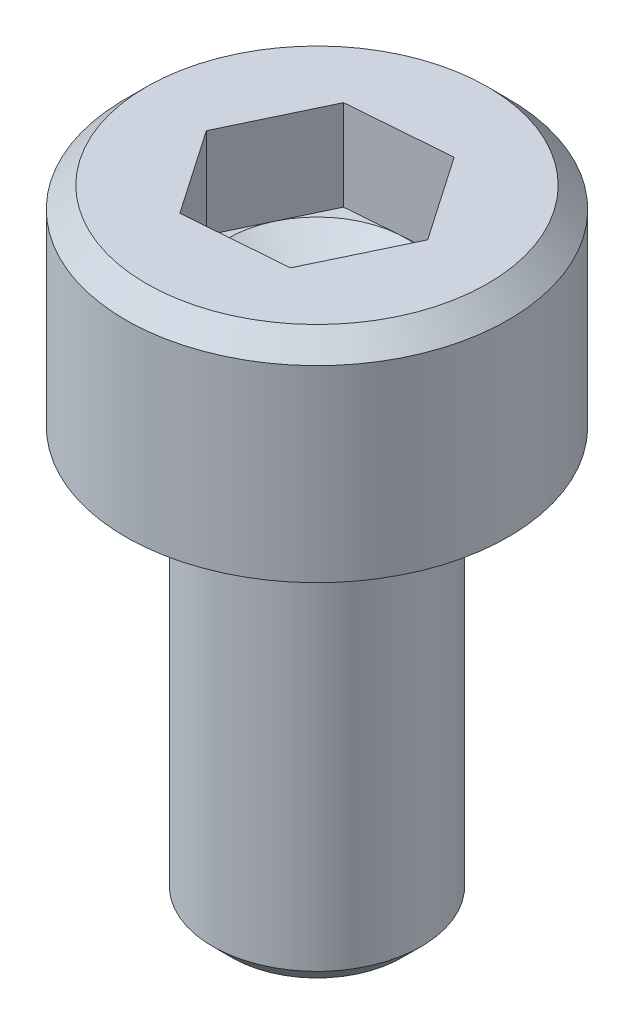
ISO-10303-21;
HEADER;
FILE_DESCRIPTION(('STEP AP214'),'2;1');
FILE_NAME('part.step','',(''),(''),'','','');
FILE_SCHEMA(('AUTOMOTIVE_DESIGN { 1 0 10303 214 1 1 1 1 }'));
ENDSEC;
DATA;
#1=APPLICATION_CONTEXT('core data for automotive mechanical design processes');
#2=APPLICATION_PROTOCOL_DEFINITION('international standard','automotive_design',2000,#1);
#3=PRODUCT_CONTEXT('',#1,'mechanical');
#4=PRODUCT('Part','Part','',(#3));
#5=PRODUCT_RELATED_PRODUCT_CATEGORY('part','',(#4));
#6=PRODUCT_DEFINITION_FORMATION('','',#4);
#7=PRODUCT_DEFINITION_CONTEXT('part definition',#1,'design');
#8=PRODUCT_DEFINITION('design','',#6,#7);
#9=PRODUCT_DEFINITION_SHAPE('','',#8);
#10=(LENGTH_UNIT() NAMED_UNIT(*) SI_UNIT(.MILLI.,.METRE.));
#11=(NAMED_UNIT(*) PLANE_ANGLE_UNIT() SI_UNIT($,.RADIAN.));
#12=(NAMED_UNIT(*) SI_UNIT($,.STERADIAN.) SOLID_ANGLE_UNIT());
#13=UNCERTAINTY_MEASURE_WITH_UNIT(LENGTH_MEASURE(1.E-05),#10,'distance_accuracy_value','');
#14=(GEOMETRIC_REPRESENTATION_CONTEXT(3) GLOBAL_UNCERTAINTY_ASSIGNED_CONTEXT((#13)) GLOBAL_UNIT_ASSIGNED_CONTEXT((#10,
#11,#12)) REPRESENTATION_CONTEXT('',''));
#15=CARTESIAN_POINT('',(0.,0.,0.));
#16=DIRECTION('',(0.,0.,1.));
#17=DIRECTION('',(1.,0.,0.));
#18=AXIS2_PLACEMENT_3D('',#15,#16,#17);
#19=CARTESIAN_POINT('',(39.5786618448895,-5.,30.553715429844));
#20=DIRECTION('',(0.,1.,0.));
#21=DIRECTION('',(-0.824102284166919,0.,0.566441016550591));
#22=AXIS2_PLACEMENT_3D('',#19,#20,#21);
#23=PLANE('',#22);
#24=DIRECTION('',(-0.99691402168063,0.,0.0785011679948349));
#25=VECTOR('',#24,1.);
#26=CARTESIAN_POINT('',(40.4158711207565,-5.,31.7717523593891));
#27=LINE('',#26,#25);
#28=CARTESIAN_POINT('',(40.4158711207565,-5.,31.7717523593891));
#29=VERTEX_POINT('',#28);
#30=CARTESIAN_POINT('',(38.9424155590894,-5.,31.8877783958013));
#31=VERTEX_POINT('',#30);
#32=EDGE_CURVE('E420',#29,#31,#27,.T.);
#33=ORIENTED_EDGE('',*,*,#32,.T.);
#34=DIRECTION('',(0.566441016550592,0.,0.824102284166918));
#35=VECTOR('',#34,1.);
#36=CARTESIAN_POINT('',(38.1052062832224,-5.,30.6697414662562));
#37=LINE('',#36,#35);
#38=CARTESIAN_POINT('',(38.1052062832224,-5.,30.6697414662562));
#39=VERTEX_POINT('',#38);
#40=EDGE_CURVE('E138',#39,#31,#37,.T.);
#41=ORIENTED_EDGE('',*,*,#40,.F.);
#42=DIRECTION('',(0.430473005130038,0.,-0.902603452161753));
#43=VECTOR('',#42,1.);
#44=CARTESIAN_POINT('',(38.1052062832224,-5.,30.6697414662562));
#45=LINE('',#44,#43);
#46=CARTESIAN_POINT('',(38.7414525690226,-5.,29.3356785002989));
#47=VERTEX_POINT('',#46);
#48=EDGE_CURVE('E423',#39,#47,#45,.T.);
#49=ORIENTED_EDGE('',*,*,#48,.T.);
#50=DIRECTION('',(0.99691402168063,0.,-0.0785011679948352));
#51=VECTOR('',#50,1.);
#52=CARTESIAN_POINT('',(38.7414525690226,-5.,29.3356785002989));
#53=LINE('',#52,#51);
#54=CARTESIAN_POINT('',(40.2149081306897,-5.,29.2196524638867));
#55=VERTEX_POINT('',#54);
#56=EDGE_CURVE('E426',#47,#55,#53,.T.);
#57=ORIENTED_EDGE('',*,*,#56,.T.);
#58=DIRECTION('',(-0.566441016550592,0.,-0.824102284166919));
#59=VECTOR('',#58,1.);
#60=CARTESIAN_POINT('',(41.0521174065567,-5.,30.4376893934318));
#61=LINE('',#60,#59);
#62=CARTESIAN_POINT('',(41.0521174065567,-5.,30.4376893934318));
#63=VERTEX_POINT('',#62);
#64=EDGE_CURVE('E429',#63,#55,#61,.T.);
#65=ORIENTED_EDGE('',*,*,#64,.F.);
#66=DIRECTION('',(0.430473005130037,0.,-0.902603452161754));
#67=VECTOR('',#66,1.);
#68=CARTESIAN_POINT('',(40.4158711207565,-5.,31.7717523593891));
#69=LINE('',#68,#67);
#70=EDGE_CURVE('E133',#29,#63,#69,.T.);
#71=ORIENTED_EDGE('',*,*,#70,.F.);
#72=EDGE_LOOP('',(#33,#41,#49,#57,#65,#71));
#73=FACE_BOUND('',#72,.T.);
#74=CARTESIAN_POINT('',(39.5786618448895,-5.,30.553715429844));
#75=DIRECTION('',(0.,1.,0.));
#76=DIRECTION('',(-0.824102284166919,0.,0.566441016550591));
#77=AXIS2_PLACEMENT_3D('',#74,#75,#76);
#78=CIRCLE('',#77,2.45);
#79=CARTESIAN_POINT('',(37.5596112486806,-5.,31.9414959203929));
#80=VERTEX_POINT('',#79);
#81=EDGE_CURVE('E149',#80,#80,#78,.T.);
#82=ORIENTED_EDGE('',*,*,#81,.T.);
#83=EDGE_LOOP('',(#82));
#84=FACE_BOUND('',#83,.T.);
#85=ADVANCED_FACE('F42',(#73,#84),#23,.T.);
#86=CARTESIAN_POINT('',(40.269436664573,-14.,31.5587081653855));
#87=DIRECTION('',(0.,-1.,0.));
#88=DIRECTION('',(0.824102284166919,0.,-0.566441016550591));
#89=AXIS2_PLACEMENT_3D('',#86,#87,#88);
#90=PLANE('',#89);
#91=CARTESIAN_POINT('',(39.5786618448895,-14.,30.553715429844));
#92=DIRECTION('',(0.,1.,0.));
#93=DIRECTION('',(-0.824102284166919,0.,0.566441016550591));
#94=AXIS2_PLACEMENT_3D('',#91,#92,#93);
#95=CIRCLE('',#94,1.2195);
#96=CARTESIAN_POINT('',(38.573669109348,-14.,31.2444902495274));
#97=VERTEX_POINT('',#96);
#98=EDGE_CURVE('E162',#97,#97,#95,.T.);
#99=ORIENTED_EDGE('',*,*,#98,.F.);
#100=EDGE_LOOP('',(#99));
#101=FACE_BOUND('',#100,.T.);
#102=ADVANCED_FACE('F182',(#101),#90,.T.);
#103=CARTESIAN_POINT('',(39.5786618448895,-14.,30.553715429844));
#104=DIRECTION('',(0.,1.,0.));
#105=DIRECTION('',(-0.824102284166919,0.,0.566441016550591));
#106=AXIS2_PLACEMENT_3D('',#103,#104,#105);
#107=CONICAL_SURFACE('',#106,1.2195,0.785398163397391);
#108=CARTESIAN_POINT('',(39.5786618448895,-13.7195,30.553715429844));
#109=DIRECTION('',(0.,1.,0.));
#110=DIRECTION('',(-0.824102284166919,0.,0.566441016550591));
#111=AXIS2_PLACEMENT_3D('',#108,#109,#110);
#112=CIRCLE('',#111,1.49999999999998);
#113=CARTESIAN_POINT('',(38.3425084186392,-13.7195,31.4033769546699));
#114=VERTEX_POINT('',#113);
#115=EDGE_CURVE('E159',#114,#114,#112,.T.);
#116=ORIENTED_EDGE('',*,*,#115,.F.);
#117=EDGE_LOOP('',(#116));
#118=FACE_BOUND('',#117,.T.);
#119=ORIENTED_EDGE('',*,*,#98,.T.);
#120=EDGE_LOOP('',(#119));
#121=FACE_BOUND('',#120,.T.);
#122=ADVANCED_FACE('F187',(#118,#121),#107,.T.);
#123=CARTESIAN_POINT('',(39.5786618448895,26.75,30.553715429844));
#124=DIRECTION('',(0.,1.,0.));
#125=DIRECTION('',(-0.824102284166919,0.,0.566441016550591));
#126=AXIS2_PLACEMENT_3D('',#123,#124,#125);
#127=CYLINDRICAL_SURFACE('',#126,1.49999999999999);
#128=CARTESIAN_POINT('',(39.5786618448895,-8.1,30.553715429844));
#129=DIRECTION('',(0.,-1.,0.));
#130=DIRECTION('',(0.824102284166919,0.,-0.566441016550591));
#131=AXIS2_PLACEMENT_3D('',#128,#129,#130);
#132=CIRCLE('',#131,1.49999999999999);
#133=CARTESIAN_POINT('',(40.8148152711399,-8.1,29.7040539050181));
#134=VERTEX_POINT('',#133);
#135=EDGE_CURVE('E11',#134,#134,#132,.T.);
#136=ORIENTED_EDGE('',*,*,#135,.T.);
#137=EDGE_LOOP('',(#136));
#138=FACE_BOUND('',#137,.T.);
#139=ORIENTED_EDGE('',*,*,#115,.T.);
#140=EDGE_LOOP('',(#139));
#141=FACE_BOUND('',#140,.T.);
#142=ADVANCED_FACE('F198',(#138,#141),#127,.T.);
#143=CARTESIAN_POINT('',(41.1363746404037,-8.,32.819996711303));
#144=DIRECTION('',(0.,-1.,0.));
#145=DIRECTION('',(0.824102284166919,0.,-0.566441016550591));
#146=AXIS2_PLACEMENT_3D('',#143,#144,#145);
#147=PLANE('',#146);
#148=CARTESIAN_POINT('',(39.5786618448895,-8.,30.553715429844));
#149=DIRECTION('',(0.,-1.,0.));
#150=DIRECTION('',(0.824102284166919,0.,-0.566441016550591));
#151=AXIS2_PLACEMENT_3D('',#148,#149,#150);
#152=CIRCLE('',#151,1.59999999999999);
#153=CARTESIAN_POINT('',(40.8972254995566,-8.,29.6474098033631));
#154=VERTEX_POINT('',#153);
#155=EDGE_CURVE('E50',#154,#154,#152,.F.);
#156=ORIENTED_EDGE('',*,*,#155,.T.);
#157=EDGE_LOOP('',(#156));
#158=FACE_BOUND('',#157,.T.);
#159=CARTESIAN_POINT('',(39.5786618448895,-8.,30.553715429844));
#160=DIRECTION('',(0.,1.,0.));
#161=DIRECTION('',(-0.824102284166919,0.,0.566441016550591));
#162=AXIS2_PLACEMENT_3D('',#159,#160,#161);
#163=CIRCLE('',#162,2.75);
#164=CARTESIAN_POINT('',(37.3123805634305,-8.,32.1114282253581));
#165=VERTEX_POINT('',#164);
#166=EDGE_CURVE('E156',#165,#165,#163,.T.);
#167=ORIENTED_EDGE('',*,*,#166,.F.);
#168=EDGE_LOOP('',(#167));
#169=FACE_BOUND('',#168,.T.);
#170=ADVANCED_FACE('F167',(#158,#169),#147,.T.);
#171=CARTESIAN_POINT('',(39.5786618448895,26.75,30.553715429844));
#172=DIRECTION('',(0.,1.,0.));
#173=DIRECTION('',(-0.824102284166919,0.,0.566441016550591));
#174=AXIS2_PLACEMENT_3D('',#171,#172,#173);
#175=CYLINDRICAL_SURFACE('',#174,2.75);
#176=ORIENTED_EDGE('',*,*,#166,.T.);
#177=EDGE_LOOP('',(#176));
#178=FACE_BOUND('',#177,.T.);
#179=CARTESIAN_POINT('',(39.5786618448895,-5.3,30.553715429844));
#180=DIRECTION('',(0.,1.,0.));
#181=DIRECTION('',(-0.824102284166919,0.,0.566441016550591));
#182=AXIS2_PLACEMENT_3D('',#179,#180,#181);
#183=CIRCLE('',#182,2.75);
#184=CARTESIAN_POINT('',(37.3123805634305,-5.3,32.1114282253581));
#185=VERTEX_POINT('',#184);
#186=EDGE_CURVE('E153',#185,#185,#183,.T.);
#187=ORIENTED_EDGE('',*,*,#186,.F.);
#188=EDGE_LOOP('',(#187));
#189=FACE_BOUND('',#188,.T.);
#190=ADVANCED_FACE('F177',(#178,#189),#175,.T.);
#191=CARTESIAN_POINT('',(39.5786618448895,-5.,30.553715429844));
#192=DIRECTION('',(0.,-1.,0.));
#193=DIRECTION('',(0.824102284166919,0.,-0.566441016550591));
#194=AXIS2_PLACEMENT_3D('',#191,#192,#193);
#195=CONICAL_SURFACE('',#194,2.45,0.785398163397448);
#196=ORIENTED_EDGE('',*,*,#186,.T.);
#197=EDGE_LOOP('',(#196));
#198=FACE_BOUND('',#197,.T.);
#199=ORIENTED_EDGE('',*,*,#81,.F.);
#200=EDGE_LOOP('',(#199));
#201=FACE_BOUND('',#200,.T.);
#202=ADVANCED_FACE('F171',(#198,#201),#195,.T.);
#203=CARTESIAN_POINT('',(39.5786618448895,-8.1,30.553715429844));
#204=DIRECTION('',(0.,-1.,0.));
#205=DIRECTION('',(0.824102284166919,0.,-0.566441016550591));
#206=AXIS2_PLACEMENT_3D('',#203,#204,#205);
#207=TOROIDAL_SURFACE('',#206,1.59999999999999,0.1);
#208=ORIENTED_EDGE('',*,*,#135,.F.);
#209=EDGE_LOOP('',(#208));
#210=FACE_BOUND('',#209,.T.);
#211=ORIENTED_EDGE('',*,*,#155,.F.);
#212=EDGE_LOOP('',(#211));
#213=FACE_BOUND('',#212,.T.);
#214=ADVANCED_FACE('F44',(#210,#213),#207,.F.);
#215=CARTESIAN_POINT('',(40.4158711207565,-6.3,31.7717523593891));
#216=DIRECTION('',(-0.0785011679948348,0.,-0.99691402168063));
#217=DIRECTION('',(0.99691402168063,0.,-0.0785011679948348));
#218=AXIS2_PLACEMENT_3D('',#215,#216,#217);
#219=PLANE('',#218);
#220=ORIENTED_EDGE('',*,*,#32,.F.);
#221=DIRECTION('',(0.,1.,0.));
#222=VECTOR('',#221,1.);
#223=CARTESIAN_POINT('',(40.4158711207565,-6.3,31.7717523593891));
#224=LINE('',#223,#222);
#225=CARTESIAN_POINT('',(40.4158711207565,-6.3,31.7717523593891));
#226=VERTEX_POINT('',#225);
#227=EDGE_CURVE('E419',#226,#29,#224,.T.);
#228=ORIENTED_EDGE('',*,*,#227,.F.);
#229=DIRECTION('',(-0.99691402168063,0.,0.0785011679948349));
#230=VECTOR('',#229,1.);
#231=CARTESIAN_POINT('',(40.4158711207565,-6.3,31.7717523593891));
#232=LINE('',#231,#230);
#233=CARTESIAN_POINT('',(39.6791433399229,-6.3,31.8297653775952));
#234=VERTEX_POINT('',#233);
#235=EDGE_CURVE('E125',#226,#234,#232,.T.);
#236=ORIENTED_EDGE('',*,*,#235,.T.);
#237=CARTESIAN_POINT('',(38.9424155590894,-6.3,31.8877783958013));
#238=VERTEX_POINT('',#237);
#239=EDGE_CURVE('E116',#234,#238,#232,.T.);
#240=ORIENTED_EDGE('',*,*,#239,.T.);
#241=DIRECTION('',(0.,1.,0.));
#242=VECTOR('',#241,1.);
#243=CARTESIAN_POINT('',(38.9424155590894,-6.3,31.8877783958013));
#244=LINE('',#243,#242);
#245=EDGE_CURVE('E130',#238,#31,#244,.T.);
#246=ORIENTED_EDGE('',*,*,#245,.T.);
#247=EDGE_LOOP('',(#220,#228,#236,#240,#246));
#248=FACE_BOUND('',#247,.T.);
#249=ADVANCED_FACE('F129',(#248),#219,.T.);
#250=CARTESIAN_POINT('',(38.1052062832224,-6.3,30.6697414662562));
#251=DIRECTION('',(-0.824102284166918,0.,0.566441016550592));
#252=DIRECTION('',(-0.566441016550592,0.,-0.824102284166918));
#253=AXIS2_PLACEMENT_3D('',#250,#251,#252);
#254=PLANE('',#253);
#255=ORIENTED_EDGE('',*,*,#40,.T.);
#256=ORIENTED_EDGE('',*,*,#245,.F.);
#257=DIRECTION('',(0.566441016550592,0.,0.824102284166918));
#258=VECTOR('',#257,1.);
#259=CARTESIAN_POINT('',(38.1052062832224,-6.3,30.6697414662562));
#260=LINE('',#259,#258);
#261=CARTESIAN_POINT('',(38.5238109211559,-6.3,31.2787599310288));
#262=VERTEX_POINT('',#261);
#263=EDGE_CURVE('E113',#262,#238,#260,.T.);
#264=ORIENTED_EDGE('',*,*,#263,.F.);
#265=CARTESIAN_POINT('',(38.1052062832224,-6.3,30.6697414662562));
#266=VERTEX_POINT('',#265);
#267=EDGE_CURVE('E124',#266,#262,#260,.T.);
#268=ORIENTED_EDGE('',*,*,#267,.F.);
#269=DIRECTION('',(0.,1.,0.));
#270=VECTOR('',#269,1.);
#271=CARTESIAN_POINT('',(38.1052062832224,-6.3,30.6697414662562));
#272=LINE('',#271,#270);
#273=EDGE_CURVE('E140',#266,#39,#272,.T.);
#274=ORIENTED_EDGE('',*,*,#273,.T.);
#275=EDGE_LOOP('',(#255,#256,#264,#268,#274));
#276=FACE_BOUND('',#275,.T.);
#277=ADVANCED_FACE('F135',(#276),#254,.F.);
#278=CARTESIAN_POINT('',(38.1052062832224,-6.3,30.6697414662562));
#279=DIRECTION('',(0.902603452161753,0.,0.430473005130038));
#280=DIRECTION('',(-0.430473005130038,0.,0.902603452161753));
#281=AXIS2_PLACEMENT_3D('',#278,#279,#280);
#282=PLANE('',#281);
#283=ORIENTED_EDGE('',*,*,#48,.F.);
#284=ORIENTED_EDGE('',*,*,#273,.F.);
#285=DIRECTION('',(0.430473005130038,0.,-0.902603452161753));
#286=VECTOR('',#285,1.);
#287=CARTESIAN_POINT('',(38.1052062832224,-6.3,30.6697414662562));
#288=LINE('',#287,#286);
#289=CARTESIAN_POINT('',(38.4233294261225,-6.3,30.0027099832775));
#290=VERTEX_POINT('',#289);
#291=EDGE_CURVE('E400',#266,#290,#288,.T.);
#292=ORIENTED_EDGE('',*,*,#291,.T.);
#293=CARTESIAN_POINT('',(38.7414525690226,-6.3,29.3356785002989));
#294=VERTEX_POINT('',#293);
#295=EDGE_CURVE('E402',#290,#294,#288,.T.);
#296=ORIENTED_EDGE('',*,*,#295,.T.);
#297=DIRECTION('',(0.,1.,0.));
#298=VECTOR('',#297,1.);
#299=CARTESIAN_POINT('',(38.7414525690226,-6.3,29.3356785002989));
#300=LINE('',#299,#298);
#301=EDGE_CURVE('E145',#294,#47,#300,.T.);
#302=ORIENTED_EDGE('',*,*,#301,.T.);
#303=EDGE_LOOP('',(#283,#284,#292,#296,#302));
#304=FACE_BOUND('',#303,.T.);
#305=ADVANCED_FACE('F253',(#304),#282,.T.);
#306=CARTESIAN_POINT('',(38.7414525690226,-6.3,29.3356785002989));
#307=DIRECTION('',(0.0785011679948353,0.,0.99691402168063));
#308=DIRECTION('',(-0.99691402168063,0.,0.0785011679948353));
#309=AXIS2_PLACEMENT_3D('',#306,#307,#308);
#310=PLANE('',#309);
#311=ORIENTED_EDGE('',*,*,#56,.F.);
#312=ORIENTED_EDGE('',*,*,#301,.F.);
#313=DIRECTION('',(0.99691402168063,0.,-0.0785011679948352));
#314=VECTOR('',#313,1.);
#315=CARTESIAN_POINT('',(38.7414525690226,-6.3,29.3356785002989));
#316=LINE('',#315,#314);
#317=CARTESIAN_POINT('',(39.4781803498562,-6.3,29.2776654820928));
#318=VERTEX_POINT('',#317);
#319=EDGE_CURVE('E405',#294,#318,#316,.T.);
#320=ORIENTED_EDGE('',*,*,#319,.T.);
#321=CARTESIAN_POINT('',(40.2149081306897,-6.3,29.2196524638867));
#322=VERTEX_POINT('',#321);
#323=EDGE_CURVE('E409',#318,#322,#316,.T.);
#324=ORIENTED_EDGE('',*,*,#323,.T.);
#325=DIRECTION('',(0.,1.,0.));
#326=VECTOR('',#325,1.);
#327=CARTESIAN_POINT('',(40.2149081306897,-6.3,29.2196524638867));
#328=LINE('',#327,#326);
#329=EDGE_CURVE('E438',#322,#55,#328,.T.);
#330=ORIENTED_EDGE('',*,*,#329,.T.);
#331=EDGE_LOOP('',(#311,#312,#320,#324,#330));
#332=FACE_BOUND('',#331,.T.);
#333=ADVANCED_FACE('F262',(#332),#310,.T.);
#334=CARTESIAN_POINT('',(41.0521174065567,-6.3,30.4376893934318));
#335=DIRECTION('',(0.824102284166919,0.,-0.566441016550592));
#336=DIRECTION('',(0.566441016550592,0.,0.824102284166919));
#337=AXIS2_PLACEMENT_3D('',#334,#335,#336);
#338=PLANE('',#337);
#339=ORIENTED_EDGE('',*,*,#64,.T.);
#340=ORIENTED_EDGE('',*,*,#329,.F.);
#341=DIRECTION('',(-0.566441016550592,0.,-0.824102284166919));
#342=VECTOR('',#341,1.);
#343=CARTESIAN_POINT('',(41.0521174065567,-6.3,30.4376893934318));
#344=LINE('',#343,#342);
#345=CARTESIAN_POINT('',(40.6335127686232,-6.3,29.8286709286592));
#346=VERTEX_POINT('',#345);
#347=EDGE_CURVE('E413',#346,#322,#344,.T.);
#348=ORIENTED_EDGE('',*,*,#347,.F.);
#349=CARTESIAN_POINT('',(41.0521174065567,-6.3,30.4376893934318));
#350=VERTEX_POINT('',#349);
#351=EDGE_CURVE('E57',#350,#346,#344,.T.);
#352=ORIENTED_EDGE('',*,*,#351,.F.);
#353=DIRECTION('',(0.,1.,0.));
#354=VECTOR('',#353,1.);
#355=CARTESIAN_POINT('',(41.0521174065567,-6.3,30.4376893934318));
#356=LINE('',#355,#354);
#357=EDGE_CURVE('E435',#350,#63,#356,.T.);
#358=ORIENTED_EDGE('',*,*,#357,.T.);
#359=EDGE_LOOP('',(#339,#340,#348,#352,#358));
#360=FACE_BOUND('',#359,.T.);
#361=ADVANCED_FACE('F272',(#360),#338,.F.);
#362=CARTESIAN_POINT('',(40.4158711207565,-6.3,31.7717523593891));
#363=DIRECTION('',(0.902603452161754,0.,0.430473005130037));
#364=DIRECTION('',(-0.430473005130037,0.,0.902603452161754));
#365=AXIS2_PLACEMENT_3D('',#362,#363,#364);
#366=PLANE('',#365);
#367=ORIENTED_EDGE('',*,*,#70,.T.);
#368=ORIENTED_EDGE('',*,*,#357,.F.);
#369=DIRECTION('',(0.430473005130037,0.,-0.902603452161754));
#370=VECTOR('',#369,1.);
#371=CARTESIAN_POINT('',(40.4158711207565,-6.3,31.7717523593891));
#372=LINE('',#371,#370);
#373=CARTESIAN_POINT('',(40.7339942636566,-6.3,31.1047208764104));
#374=VERTEX_POINT('',#373);
#375=EDGE_CURVE('E415',#374,#350,#372,.T.);
#376=ORIENTED_EDGE('',*,*,#375,.F.);
#377=EDGE_CURVE('E416',#226,#374,#372,.T.);
#378=ORIENTED_EDGE('',*,*,#377,.F.);
#379=ORIENTED_EDGE('',*,*,#227,.T.);
#380=EDGE_LOOP('',(#367,#368,#376,#378,#379));
#381=FACE_BOUND('',#380,.T.);
#382=ADVANCED_FACE('F282',(#381),#366,.F.);
#383=CARTESIAN_POINT('',(40.4158711207565,-6.3,31.7717523593891));
#384=DIRECTION('',(0.,-1.,0.));
#385=DIRECTION('',(0.824102284166919,0.,-0.566441016550591));
#386=AXIS2_PLACEMENT_3D('',#383,#384,#385);
#387=PLANE('',#386);
#388=ORIENTED_EDGE('',*,*,#347,.T.);
#389=ORIENTED_EDGE('',*,*,#323,.F.);
#390=CARTESIAN_POINT('',(39.5786618448895,-6.3,30.553715429844));
#391=DIRECTION('',(0.,1.,0.));
#392=DIRECTION('',(-0.824102284166919,0.,0.566441016550591));
#393=AXIS2_PLACEMENT_3D('',#390,#391,#392);
#394=CIRCLE('',#393,1.28);
#395=EDGE_CURVE('E445',#346,#318,#394,.T.);
#396=ORIENTED_EDGE('',*,*,#395,.F.);
#397=EDGE_LOOP('',(#388,#389,#396));
#398=FACE_BOUND('',#397,.T.);
#399=ADVANCED_FACE('F292',(#398),#387,.F.);
#400=ORIENTED_EDGE('',*,*,#319,.F.);
#401=ORIENTED_EDGE('',*,*,#295,.F.);
#402=EDGE_CURVE('E143',#318,#290,#394,.T.);
#403=ORIENTED_EDGE('',*,*,#402,.F.);
#404=EDGE_LOOP('',(#400,#401,#403));
#405=FACE_BOUND('',#404,.T.);
#406=ADVANCED_FACE('F302',(#405),#387,.F.);
#407=ORIENTED_EDGE('',*,*,#291,.F.);
#408=ORIENTED_EDGE('',*,*,#267,.T.);
#409=EDGE_CURVE('E139',#290,#262,#394,.T.);
#410=ORIENTED_EDGE('',*,*,#409,.F.);
#411=EDGE_LOOP('',(#407,#408,#410));
#412=FACE_BOUND('',#411,.T.);
#413=ADVANCED_FACE('F313',(#412),#387,.F.);
#414=ORIENTED_EDGE('',*,*,#263,.T.);
#415=ORIENTED_EDGE('',*,*,#239,.F.);
#416=EDGE_CURVE('E119',#262,#234,#394,.T.);
#417=ORIENTED_EDGE('',*,*,#416,.F.);
#418=EDGE_LOOP('',(#414,#415,#417));
#419=FACE_BOUND('',#418,.T.);
#420=ADVANCED_FACE('F115',(#419),#387,.F.);
#421=ORIENTED_EDGE('',*,*,#235,.F.);
#422=ORIENTED_EDGE('',*,*,#377,.T.);
#423=EDGE_CURVE('E150',#234,#374,#394,.T.);
#424=ORIENTED_EDGE('',*,*,#423,.F.);
#425=EDGE_LOOP('',(#421,#422,#424));
#426=FACE_BOUND('',#425,.T.);
#427=ADVANCED_FACE('F330',(#426),#387,.F.);
#428=ORIENTED_EDGE('',*,*,#375,.T.);
#429=ORIENTED_EDGE('',*,*,#351,.T.);
#430=EDGE_CURVE('E444',#374,#346,#394,.T.);
#431=ORIENTED_EDGE('',*,*,#430,.F.);
#432=EDGE_LOOP('',(#428,#429,#431));
#433=FACE_BOUND('',#432,.T.);
#434=ADVANCED_FACE('F305',(#433),#387,.F.);
#435=CARTESIAN_POINT('',(39.5786618448895,-6.3,30.553715429844));
#436=DIRECTION('',(0.,1.,0.));
#437=DIRECTION('',(-0.824102284166919,0.,0.566441016550591));
#438=AXIS2_PLACEMENT_3D('',#435,#436,#437);
#439=CONICAL_SURFACE('',#438,1.28,1.0471975511966);
#440=CARTESIAN_POINT('',(39.5786618448895,-7.03900834456273,30.553715429844));
#441=VERTEX_POINT('',#440);
#442=VERTEX_LOOP('',#441);
#443=FACE_BOUND('',#442,.T.);
#444=ORIENTED_EDGE('',*,*,#416,.T.);
#445=ORIENTED_EDGE('',*,*,#423,.T.);
#446=ORIENTED_EDGE('',*,*,#430,.T.);
#447=ORIENTED_EDGE('',*,*,#395,.T.);
#448=ORIENTED_EDGE('',*,*,#402,.T.);
#449=ORIENTED_EDGE('',*,*,#409,.T.);
#450=EDGE_LOOP('',(#444,#445,#446,#447,#448,#449));
#451=FACE_BOUND('',#450,.T.);
#452=ADVANCED_FACE('F191',(#443,#451),#439,.F.);
#453=CLOSED_SHELL('',(#85,#102,#122,#142,#170,#190,#202,#214,#249,#277,#305,#333,#361,#382,#399,
#406,#413,#420,#427,#434,#452));
#454=MANIFOLD_SOLID_BREP('B2',#453);
#455=ADVANCED_BREP_SHAPE_REPRESENTATION('',(#18,#454),#14);
#456=SHAPE_DEFINITION_REPRESENTATION(#9,#455);
ENDSEC;
END-ISO-10303-21;
